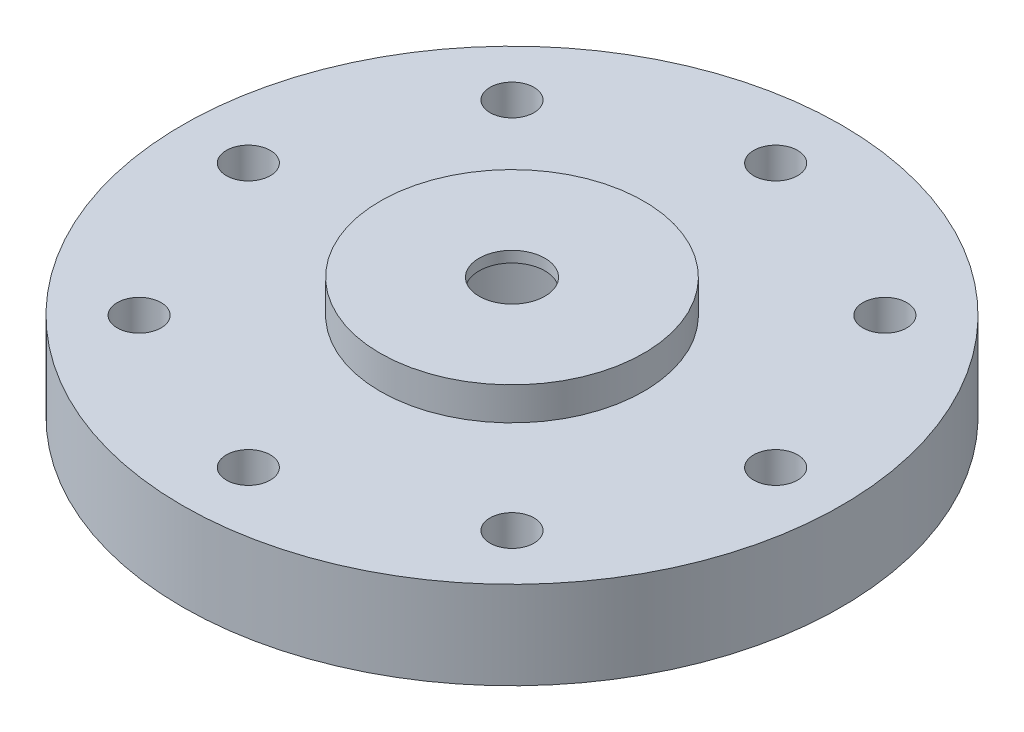
ISO-10303-21;
HEADER;
FILE_DESCRIPTION(('STEP AP214'),'2;1');
FILE_NAME('part.step','',(''),(''),'','','');
FILE_SCHEMA(('AUTOMOTIVE_DESIGN { 1 0 10303 214 1 1 1 1 }'));
ENDSEC;
DATA;
#1=APPLICATION_CONTEXT('core data for automotive mechanical design processes');
#2=APPLICATION_PROTOCOL_DEFINITION('international standard','automotive_design',2000,#1);
#3=PRODUCT_CONTEXT('',#1,'mechanical');
#4=PRODUCT('Part','Part','',(#3));
#5=PRODUCT_RELATED_PRODUCT_CATEGORY('part','',(#4));
#6=PRODUCT_DEFINITION_FORMATION('','',#4);
#7=PRODUCT_DEFINITION_CONTEXT('part definition',#1,'design');
#8=PRODUCT_DEFINITION('design','',#6,#7);
#9=PRODUCT_DEFINITION_SHAPE('','',#8);
#10=(LENGTH_UNIT() NAMED_UNIT(*) SI_UNIT(.MILLI.,.METRE.));
#11=(NAMED_UNIT(*) PLANE_ANGLE_UNIT() SI_UNIT($,.RADIAN.));
#12=(NAMED_UNIT(*) SI_UNIT($,.STERADIAN.) SOLID_ANGLE_UNIT());
#13=UNCERTAINTY_MEASURE_WITH_UNIT(LENGTH_MEASURE(1.E-05),#10,'distance_accuracy_value','');
#14=(GEOMETRIC_REPRESENTATION_CONTEXT(3) GLOBAL_UNCERTAINTY_ASSIGNED_CONTEXT((#13)) GLOBAL_UNIT_ASSIGNED_CONTEXT((#10,
#11,#12)) REPRESENTATION_CONTEXT('',''));
#15=CARTESIAN_POINT('',(0.,0.,0.));
#16=DIRECTION('',(0.,0.,1.));
#17=DIRECTION('',(1.,0.,0.));
#18=AXIS2_PLACEMENT_3D('',#15,#16,#17);
#19=CARTESIAN_POINT('',(0.,4.,0.));
#20=DIRECTION('',(0.,-1.,0.));
#21=DIRECTION('',(0.,0.,-1.));
#22=AXIS2_PLACEMENT_3D('',#19,#20,#21);
#23=CYLINDRICAL_SURFACE('',#22,1.5);
#24=CARTESIAN_POINT('',(0.,5.5,0.));
#25=DIRECTION('',(0.,1.,0.));
#26=DIRECTION('',(0.,0.,1.));
#27=AXIS2_PLACEMENT_3D('',#24,#25,#26);
#28=CIRCLE('',#27,1.5);
#29=CARTESIAN_POINT('',(0.,5.5,1.5));
#30=VERTEX_POINT('',#29);
#31=EDGE_CURVE('E107',#30,#30,#28,.T.);
#32=ORIENTED_EDGE('',*,*,#31,.T.);
#33=EDGE_LOOP('',(#32));
#34=FACE_BOUND('',#33,.T.);
#35=CARTESIAN_POINT('',(0.,5.,0.));
#36=DIRECTION('',(0.,-1.,0.));
#37=DIRECTION('',(0.,0.,-1.));
#38=AXIS2_PLACEMENT_3D('',#35,#36,#37);
#39=CIRCLE('',#38,1.5);
#40=CARTESIAN_POINT('',(0.,5.,-1.5));
#41=VERTEX_POINT('',#40);
#42=EDGE_CURVE('E45',#41,#41,#39,.T.);
#43=ORIENTED_EDGE('',*,*,#42,.T.);
#44=EDGE_LOOP('',(#43));
#45=FACE_BOUND('',#44,.T.);
#46=ADVANCED_FACE('F41',(#34,#45),#23,.F.);
#47=CARTESIAN_POINT('',(0.,4.,0.));
#48=DIRECTION('',(0.,1.,0.));
#49=DIRECTION('',(0.,0.,1.));
#50=AXIS2_PLACEMENT_3D('',#47,#48,#49);
#51=PLANE('',#50);
#52=CARTESIAN_POINT('',(-12.,4.,0.));
#53=DIRECTION('',(0.,1.,0.));
#54=DIRECTION('',(0.,0.,1.));
#55=AXIS2_PLACEMENT_3D('',#52,#53,#54);
#56=CIRCLE('',#55,1.);
#57=CARTESIAN_POINT('',(-12.,4.,1.00000000000005));
#58=VERTEX_POINT('',#57);
#59=EDGE_CURVE('E89',#58,#58,#56,.T.);
#60=ORIENTED_EDGE('',*,*,#59,.F.);
#61=EDGE_LOOP('',(#60));
#62=FACE_BOUND('',#61,.T.);
#63=CARTESIAN_POINT('',(-8.48528137423856,4.,8.48528137423859));
#64=DIRECTION('',(0.,1.,0.));
#65=DIRECTION('',(0.,0.,1.));
#66=AXIS2_PLACEMENT_3D('',#63,#64,#65);
#67=CIRCLE('',#66,1.);
#68=CARTESIAN_POINT('',(-8.48528137423856,4.,9.48528137423859));
#69=VERTEX_POINT('',#68);
#70=EDGE_CURVE('E77',#69,#69,#67,.T.);
#71=ORIENTED_EDGE('',*,*,#70,.F.);
#72=EDGE_LOOP('',(#71));
#73=FACE_BOUND('',#72,.T.);
#74=CARTESIAN_POINT('',(8.48528137423856,4.,8.48528137423859));
#75=DIRECTION('',(0.,1.,0.));
#76=DIRECTION('',(0.,0.,-1.));
#77=AXIS2_PLACEMENT_3D('',#74,#75,#76);
#78=CIRCLE('',#77,1.);
#79=CARTESIAN_POINT('',(8.48528137423856,4.,7.48528137423858));
#80=VERTEX_POINT('',#79);
#81=EDGE_CURVE('E65',#80,#80,#78,.T.);
#82=ORIENTED_EDGE('',*,*,#81,.F.);
#83=EDGE_LOOP('',(#82));
#84=FACE_BOUND('',#83,.T.);
#85=CARTESIAN_POINT('',(0.,4.,-12.));
#86=DIRECTION('',(0.,1.,0.));
#87=DIRECTION('',(0.,0.,1.));
#88=AXIS2_PLACEMENT_3D('',#85,#86,#87);
#89=CIRCLE('',#88,1.);
#90=CARTESIAN_POINT('',(0.,4.,-11.));
#91=VERTEX_POINT('',#90);
#92=EDGE_CURVE('E54',#91,#91,#89,.T.);
#93=ORIENTED_EDGE('',*,*,#92,.F.);
#94=EDGE_LOOP('',(#93));
#95=FACE_BOUND('',#94,.T.);
#96=CARTESIAN_POINT('',(0.,4.,0.));
#97=DIRECTION('',(0.,1.,0.));
#98=DIRECTION('',(0.,0.,1.));
#99=AXIS2_PLACEMENT_3D('',#96,#97,#98);
#100=CIRCLE('',#99,15.);
#101=CARTESIAN_POINT('',(0.,4.,15.));
#102=VERTEX_POINT('',#101);
#103=EDGE_CURVE('E10',#102,#102,#100,.T.);
#104=ORIENTED_EDGE('',*,*,#103,.T.);
#105=EDGE_LOOP('',(#104));
#106=FACE_BOUND('',#105,.T.);
#107=CARTESIAN_POINT('',(8.48528137423855,4.,-8.48528137423859));
#108=DIRECTION('',(0.,1.,0.));
#109=DIRECTION('',(0.,0.,1.));
#110=AXIS2_PLACEMENT_3D('',#107,#108,#109);
#111=CIRCLE('',#110,1.);
#112=CARTESIAN_POINT('',(8.48528137423855,4.,-7.48528137423859));
#113=VERTEX_POINT('',#112);
#114=EDGE_CURVE('E59',#113,#113,#111,.T.);
#115=ORIENTED_EDGE('',*,*,#114,.F.);
#116=EDGE_LOOP('',(#115));
#117=FACE_BOUND('',#116,.T.);
#118=CARTESIAN_POINT('',(0.,4.,12.));
#119=DIRECTION('',(0.,1.,0.));
#120=DIRECTION('',(0.,0.,-1.));
#121=AXIS2_PLACEMENT_3D('',#118,#119,#120);
#122=CIRCLE('',#121,1.);
#123=CARTESIAN_POINT('',(0.,4.,11.));
#124=VERTEX_POINT('',#123);
#125=EDGE_CURVE('E71',#124,#124,#122,.T.);
#126=ORIENTED_EDGE('',*,*,#125,.F.);
#127=EDGE_LOOP('',(#126));
#128=FACE_BOUND('',#127,.T.);
#129=CARTESIAN_POINT('',(-8.48528137423855,4.,-8.48528137423859));
#130=DIRECTION('',(0.,1.,0.));
#131=DIRECTION('',(0.,0.,-1.));
#132=AXIS2_PLACEMENT_3D('',#129,#130,#131);
#133=CIRCLE('',#132,1.);
#134=CARTESIAN_POINT('',(-8.48528137423855,4.,-9.48528137423859));
#135=VERTEX_POINT('',#134);
#136=EDGE_CURVE('E83',#135,#135,#133,.T.);
#137=ORIENTED_EDGE('',*,*,#136,.F.);
#138=EDGE_LOOP('',(#137));
#139=FACE_BOUND('',#138,.T.);
#140=CARTESIAN_POINT('',(12.,4.,0.));
#141=DIRECTION('',(0.,1.,0.));
#142=DIRECTION('',(0.,0.,-1.));
#143=AXIS2_PLACEMENT_3D('',#140,#141,#142);
#144=CIRCLE('',#143,1.);
#145=CARTESIAN_POINT('',(12.,4.,-1.00000000000005));
#146=VERTEX_POINT('',#145);
#147=EDGE_CURVE('E95',#146,#146,#144,.T.);
#148=ORIENTED_EDGE('',*,*,#147,.F.);
#149=EDGE_LOOP('',(#148));
#150=FACE_BOUND('',#149,.T.);
#151=CARTESIAN_POINT('',(0.,4.,0.));
#152=DIRECTION('',(0.,1.,0.));
#153=DIRECTION('',(0.,0.,1.));
#154=AXIS2_PLACEMENT_3D('',#151,#152,#153);
#155=CIRCLE('',#154,6.);
#156=CARTESIAN_POINT('',(0.,4.,6.));
#157=VERTEX_POINT('',#156);
#158=EDGE_CURVE('E104',#157,#157,#155,.T.);
#159=ORIENTED_EDGE('',*,*,#158,.F.);
#160=EDGE_LOOP('',(#159));
#161=FACE_BOUND('',#160,.T.);
#162=ADVANCED_FACE('F134',(#62,#73,#84,#95,#106,#117,#128,#139,#150,#161),#51,.T.);
#163=CARTESIAN_POINT('',(0.,0.,0.));
#164=DIRECTION('',(0.,1.,0.));
#165=DIRECTION('',(0.,0.,1.));
#166=AXIS2_PLACEMENT_3D('',#163,#164,#165);
#167=PLANE('',#166);
#168=CARTESIAN_POINT('',(0.,0.,0.));
#169=DIRECTION('',(0.,-1.,0.));
#170=DIRECTION('',(0.,0.,-1.));
#171=AXIS2_PLACEMENT_3D('',#168,#169,#170);
#172=CIRCLE('',#171,4.5);
#173=CARTESIAN_POINT('',(0.,0.,-4.5));
#174=VERTEX_POINT('',#173);
#175=EDGE_CURVE('E112',#174,#174,#172,.T.);
#176=ORIENTED_EDGE('',*,*,#175,.F.);
#177=EDGE_LOOP('',(#176));
#178=FACE_BOUND('',#177,.T.);
#179=CARTESIAN_POINT('',(0.,0.,0.));
#180=DIRECTION('',(0.,1.,0.));
#181=DIRECTION('',(0.,0.,1.));
#182=AXIS2_PLACEMENT_3D('',#179,#180,#181);
#183=CIRCLE('',#182,15.);
#184=CARTESIAN_POINT('',(0.,0.,15.));
#185=VERTEX_POINT('',#184);
#186=EDGE_CURVE('E49',#185,#185,#183,.T.);
#187=ORIENTED_EDGE('',*,*,#186,.F.);
#188=EDGE_LOOP('',(#187));
#189=FACE_BOUND('',#188,.T.);
#190=CARTESIAN_POINT('',(0.,0.,-12.));
#191=DIRECTION('',(0.,1.,0.));
#192=DIRECTION('',(0.,0.,1.));
#193=AXIS2_PLACEMENT_3D('',#190,#191,#192);
#194=CIRCLE('',#193,1.);
#195=CARTESIAN_POINT('',(0.,0.,-11.));
#196=VERTEX_POINT('',#195);
#197=EDGE_CURVE('E56',#196,#196,#194,.T.);
#198=ORIENTED_EDGE('',*,*,#197,.T.);
#199=EDGE_LOOP('',(#198));
#200=FACE_BOUND('',#199,.T.);
#201=CARTESIAN_POINT('',(8.48528137423855,0.,-8.48528137423859));
#202=DIRECTION('',(0.,1.,0.));
#203=DIRECTION('',(0.,0.,1.));
#204=AXIS2_PLACEMENT_3D('',#201,#202,#203);
#205=CIRCLE('',#204,1.);
#206=CARTESIAN_POINT('',(8.48528137423855,0.,-7.48528137423859));
#207=VERTEX_POINT('',#206);
#208=EDGE_CURVE('E62',#207,#207,#205,.T.);
#209=ORIENTED_EDGE('',*,*,#208,.T.);
#210=EDGE_LOOP('',(#209));
#211=FACE_BOUND('',#210,.T.);
#212=CARTESIAN_POINT('',(8.48528137423856,0.,8.48528137423859));
#213=DIRECTION('',(0.,1.,0.));
#214=DIRECTION('',(0.,0.,-1.));
#215=AXIS2_PLACEMENT_3D('',#212,#213,#214);
#216=CIRCLE('',#215,1.);
#217=CARTESIAN_POINT('',(8.48528137423856,0.,7.48528137423858));
#218=VERTEX_POINT('',#217);
#219=EDGE_CURVE('E68',#218,#218,#216,.T.);
#220=ORIENTED_EDGE('',*,*,#219,.T.);
#221=EDGE_LOOP('',(#220));
#222=FACE_BOUND('',#221,.T.);
#223=CARTESIAN_POINT('',(0.,0.,12.));
#224=DIRECTION('',(0.,1.,0.));
#225=DIRECTION('',(0.,0.,-1.));
#226=AXIS2_PLACEMENT_3D('',#223,#224,#225);
#227=CIRCLE('',#226,1.);
#228=CARTESIAN_POINT('',(0.,0.,11.));
#229=VERTEX_POINT('',#228);
#230=EDGE_CURVE('E74',#229,#229,#227,.T.);
#231=ORIENTED_EDGE('',*,*,#230,.T.);
#232=EDGE_LOOP('',(#231));
#233=FACE_BOUND('',#232,.T.);
#234=CARTESIAN_POINT('',(-8.48528137423856,0.,8.48528137423859));
#235=DIRECTION('',(0.,1.,0.));
#236=DIRECTION('',(0.,0.,1.));
#237=AXIS2_PLACEMENT_3D('',#234,#235,#236);
#238=CIRCLE('',#237,1.);
#239=CARTESIAN_POINT('',(-8.48528137423856,0.,9.48528137423859));
#240=VERTEX_POINT('',#239);
#241=EDGE_CURVE('E80',#240,#240,#238,.T.);
#242=ORIENTED_EDGE('',*,*,#241,.T.);
#243=EDGE_LOOP('',(#242));
#244=FACE_BOUND('',#243,.T.);
#245=CARTESIAN_POINT('',(-8.48528137423855,0.,-8.48528137423859));
#246=DIRECTION('',(0.,1.,0.));
#247=DIRECTION('',(0.,0.,-1.));
#248=AXIS2_PLACEMENT_3D('',#245,#246,#247);
#249=CIRCLE('',#248,1.);
#250=CARTESIAN_POINT('',(-8.48528137423855,0.,-9.48528137423859));
#251=VERTEX_POINT('',#250);
#252=EDGE_CURVE('E86',#251,#251,#249,.T.);
#253=ORIENTED_EDGE('',*,*,#252,.T.);
#254=EDGE_LOOP('',(#253));
#255=FACE_BOUND('',#254,.T.);
#256=CARTESIAN_POINT('',(-12.,0.,0.));
#257=DIRECTION('',(0.,1.,0.));
#258=DIRECTION('',(0.,0.,1.));
#259=AXIS2_PLACEMENT_3D('',#256,#257,#258);
#260=CIRCLE('',#259,1.);
#261=CARTESIAN_POINT('',(-12.,0.,1.00000000000005));
#262=VERTEX_POINT('',#261);
#263=EDGE_CURVE('E92',#262,#262,#260,.T.);
#264=ORIENTED_EDGE('',*,*,#263,.T.);
#265=EDGE_LOOP('',(#264));
#266=FACE_BOUND('',#265,.T.);
#267=CARTESIAN_POINT('',(12.,0.,0.));
#268=DIRECTION('',(0.,1.,0.));
#269=DIRECTION('',(0.,0.,-1.));
#270=AXIS2_PLACEMENT_3D('',#267,#268,#269);
#271=CIRCLE('',#270,1.);
#272=CARTESIAN_POINT('',(12.,0.,-1.00000000000005));
#273=VERTEX_POINT('',#272);
#274=EDGE_CURVE('E98',#273,#273,#271,.T.);
#275=ORIENTED_EDGE('',*,*,#274,.T.);
#276=EDGE_LOOP('',(#275));
#277=FACE_BOUND('',#276,.T.);
#278=ADVANCED_FACE('F140',(#178,#189,#200,#211,#222,#233,#244,#255,#266,#277),#167,.F.);
#279=CARTESIAN_POINT('',(0.,4.,0.));
#280=DIRECTION('',(0.,-1.,0.));
#281=DIRECTION('',(0.,0.,-1.));
#282=AXIS2_PLACEMENT_3D('',#279,#280,#281);
#283=CYLINDRICAL_SURFACE('',#282,15.);
#284=ORIENTED_EDGE('',*,*,#103,.F.);
#285=EDGE_LOOP('',(#284));
#286=FACE_BOUND('',#285,.T.);
#287=ORIENTED_EDGE('',*,*,#186,.T.);
#288=EDGE_LOOP('',(#287));
#289=FACE_BOUND('',#288,.T.);
#290=ADVANCED_FACE('F43',(#286,#289),#283,.T.);
#291=CARTESIAN_POINT('',(0.,4.,-12.));
#292=DIRECTION('',(0.,-1.,0.));
#293=DIRECTION('',(0.,0.,-1.));
#294=AXIS2_PLACEMENT_3D('',#291,#292,#293);
#295=CYLINDRICAL_SURFACE('',#294,1.);
#296=ORIENTED_EDGE('',*,*,#92,.T.);
#297=EDGE_LOOP('',(#296));
#298=FACE_BOUND('',#297,.T.);
#299=ORIENTED_EDGE('',*,*,#197,.F.);
#300=EDGE_LOOP('',(#299));
#301=FACE_BOUND('',#300,.T.);
#302=ADVANCED_FACE('F174',(#298,#301),#295,.F.);
#303=CARTESIAN_POINT('',(8.48528137423855,4.,-8.48528137423859));
#304=DIRECTION('',(0.,-1.,0.));
#305=DIRECTION('',(0.,0.,-1.));
#306=AXIS2_PLACEMENT_3D('',#303,#304,#305);
#307=CYLINDRICAL_SURFACE('',#306,1.);
#308=ORIENTED_EDGE('',*,*,#114,.T.);
#309=EDGE_LOOP('',(#308));
#310=FACE_BOUND('',#309,.T.);
#311=ORIENTED_EDGE('',*,*,#208,.F.);
#312=EDGE_LOOP('',(#311));
#313=FACE_BOUND('',#312,.T.);
#314=ADVANCED_FACE('F170',(#310,#313),#307,.F.);
#315=CARTESIAN_POINT('',(8.48528137423856,4.,8.48528137423859));
#316=DIRECTION('',(0.,-1.,0.));
#317=DIRECTION('',(0.,0.,-1.));
#318=AXIS2_PLACEMENT_3D('',#315,#316,#317);
#319=CYLINDRICAL_SURFACE('',#318,1.);
#320=ORIENTED_EDGE('',*,*,#81,.T.);
#321=EDGE_LOOP('',(#320));
#322=FACE_BOUND('',#321,.T.);
#323=ORIENTED_EDGE('',*,*,#219,.F.);
#324=EDGE_LOOP('',(#323));
#325=FACE_BOUND('',#324,.T.);
#326=ADVANCED_FACE('F166',(#322,#325),#319,.F.);
#327=CARTESIAN_POINT('',(0.,4.,12.));
#328=DIRECTION('',(0.,-1.,0.));
#329=DIRECTION('',(0.,0.,-1.));
#330=AXIS2_PLACEMENT_3D('',#327,#328,#329);
#331=CYLINDRICAL_SURFACE('',#330,1.);
#332=ORIENTED_EDGE('',*,*,#125,.T.);
#333=EDGE_LOOP('',(#332));
#334=FACE_BOUND('',#333,.T.);
#335=ORIENTED_EDGE('',*,*,#230,.F.);
#336=EDGE_LOOP('',(#335));
#337=FACE_BOUND('',#336,.T.);
#338=ADVANCED_FACE('F162',(#334,#337),#331,.F.);
#339=CARTESIAN_POINT('',(-8.48528137423856,4.,8.48528137423859));
#340=DIRECTION('',(0.,-1.,0.));
#341=DIRECTION('',(0.,0.,-1.));
#342=AXIS2_PLACEMENT_3D('',#339,#340,#341);
#343=CYLINDRICAL_SURFACE('',#342,1.);
#344=ORIENTED_EDGE('',*,*,#70,.T.);
#345=EDGE_LOOP('',(#344));
#346=FACE_BOUND('',#345,.T.);
#347=ORIENTED_EDGE('',*,*,#241,.F.);
#348=EDGE_LOOP('',(#347));
#349=FACE_BOUND('',#348,.T.);
#350=ADVANCED_FACE('F158',(#346,#349),#343,.F.);
#351=CARTESIAN_POINT('',(-8.48528137423855,4.,-8.48528137423859));
#352=DIRECTION('',(0.,-1.,0.));
#353=DIRECTION('',(0.,0.,-1.));
#354=AXIS2_PLACEMENT_3D('',#351,#352,#353);
#355=CYLINDRICAL_SURFACE('',#354,1.);
#356=ORIENTED_EDGE('',*,*,#136,.T.);
#357=EDGE_LOOP('',(#356));
#358=FACE_BOUND('',#357,.T.);
#359=ORIENTED_EDGE('',*,*,#252,.F.);
#360=EDGE_LOOP('',(#359));
#361=FACE_BOUND('',#360,.T.);
#362=ADVANCED_FACE('F154',(#358,#361),#355,.F.);
#363=CARTESIAN_POINT('',(-12.,4.,0.));
#364=DIRECTION('',(0.,-1.,0.));
#365=DIRECTION('',(0.,0.,-1.));
#366=AXIS2_PLACEMENT_3D('',#363,#364,#365);
#367=CYLINDRICAL_SURFACE('',#366,1.);
#368=ORIENTED_EDGE('',*,*,#59,.T.);
#369=EDGE_LOOP('',(#368));
#370=FACE_BOUND('',#369,.T.);
#371=ORIENTED_EDGE('',*,*,#263,.F.);
#372=EDGE_LOOP('',(#371));
#373=FACE_BOUND('',#372,.T.);
#374=ADVANCED_FACE('F150',(#370,#373),#367,.F.);
#375=CARTESIAN_POINT('',(12.,4.,0.));
#376=DIRECTION('',(0.,-1.,0.));
#377=DIRECTION('',(0.,0.,-1.));
#378=AXIS2_PLACEMENT_3D('',#375,#376,#377);
#379=CYLINDRICAL_SURFACE('',#378,1.);
#380=ORIENTED_EDGE('',*,*,#147,.T.);
#381=EDGE_LOOP('',(#380));
#382=FACE_BOUND('',#381,.T.);
#383=ORIENTED_EDGE('',*,*,#274,.F.);
#384=EDGE_LOOP('',(#383));
#385=FACE_BOUND('',#384,.T.);
#386=ADVANCED_FACE('F146',(#382,#385),#379,.F.);
#387=CARTESIAN_POINT('',(0.,5.5,0.));
#388=DIRECTION('',(0.,1.,0.));
#389=DIRECTION('',(0.,0.,1.));
#390=AXIS2_PLACEMENT_3D('',#387,#388,#389);
#391=PLANE('',#390);
#392=CARTESIAN_POINT('',(0.,5.5,0.));
#393=DIRECTION('',(0.,1.,0.));
#394=DIRECTION('',(0.,0.,1.));
#395=AXIS2_PLACEMENT_3D('',#392,#393,#394);
#396=CIRCLE('',#395,6.);
#397=CARTESIAN_POINT('',(0.,5.5,6.));
#398=VERTEX_POINT('',#397);
#399=EDGE_CURVE('E101',#398,#398,#396,.T.);
#400=ORIENTED_EDGE('',*,*,#399,.T.);
#401=EDGE_LOOP('',(#400));
#402=FACE_BOUND('',#401,.T.);
#403=ORIENTED_EDGE('',*,*,#31,.F.);
#404=EDGE_LOOP('',(#403));
#405=FACE_BOUND('',#404,.T.);
#406=ADVANCED_FACE('F149',(#402,#405),#391,.T.);
#407=CARTESIAN_POINT('',(0.,5.5,0.));
#408=DIRECTION('',(0.,-1.,0.));
#409=DIRECTION('',(0.,0.,-1.));
#410=AXIS2_PLACEMENT_3D('',#407,#408,#409);
#411=CYLINDRICAL_SURFACE('',#410,6.);
#412=ORIENTED_EDGE('',*,*,#399,.F.);
#413=EDGE_LOOP('',(#412));
#414=FACE_BOUND('',#413,.T.);
#415=ORIENTED_EDGE('',*,*,#158,.T.);
#416=EDGE_LOOP('',(#415));
#417=FACE_BOUND('',#416,.T.);
#418=ADVANCED_FACE('F130',(#414,#417),#411,.T.);
#419=CARTESIAN_POINT('',(0.,5.,0.));
#420=DIRECTION('',(0.,-1.,0.));
#421=DIRECTION('',(0.,0.,-1.));
#422=AXIS2_PLACEMENT_3D('',#419,#420,#421);
#423=CYLINDRICAL_SURFACE('',#422,4.5);
#424=CARTESIAN_POINT('',(0.,5.,0.));
#425=DIRECTION('',(0.,-1.,0.));
#426=DIRECTION('',(0.,0.,-1.));
#427=AXIS2_PLACEMENT_3D('',#424,#425,#426);
#428=CIRCLE('',#427,4.5);
#429=CARTESIAN_POINT('',(0.,5.,-4.5));
#430=VERTEX_POINT('',#429);
#431=EDGE_CURVE('E115',#430,#430,#428,.T.);
#432=ORIENTED_EDGE('',*,*,#431,.F.);
#433=EDGE_LOOP('',(#432));
#434=FACE_BOUND('',#433,.T.);
#435=ORIENTED_EDGE('',*,*,#175,.T.);
#436=EDGE_LOOP('',(#435));
#437=FACE_BOUND('',#436,.T.);
#438=ADVANCED_FACE('F125',(#434,#437),#423,.F.);
#439=CARTESIAN_POINT('',(0.,5.,0.));
#440=DIRECTION('',(0.,-1.,0.));
#441=DIRECTION('',(0.,0.,-1.));
#442=AXIS2_PLACEMENT_3D('',#439,#440,#441);
#443=PLANE('',#442);
#444=ORIENTED_EDGE('',*,*,#42,.F.);
#445=EDGE_LOOP('',(#444));
#446=FACE_BOUND('',#445,.T.);
#447=ORIENTED_EDGE('',*,*,#431,.T.);
#448=EDGE_LOOP('',(#447));
#449=FACE_BOUND('',#448,.T.);
#450=ADVANCED_FACE('F123',(#446,#449),#443,.T.);
#451=CLOSED_SHELL('',(#46,#162,#278,#290,#302,#314,#326,#338,#350,#362,#374,#386,#406,#418,#438,#450));
#452=MANIFOLD_SOLID_BREP('B2',#451);
#453=ADVANCED_BREP_SHAPE_REPRESENTATION('',(#18,#452),#14);
#454=SHAPE_DEFINITION_REPRESENTATION(#9,#453);
ENDSEC;
END-ISO-10303-21;
